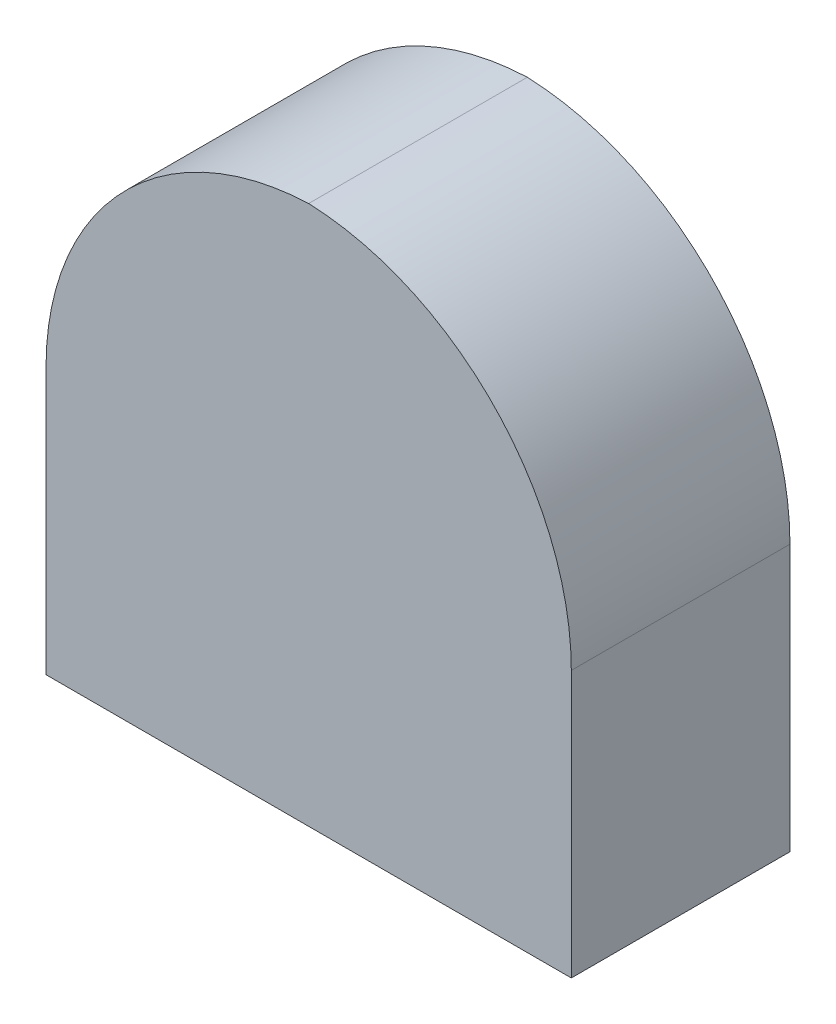
ISO-10303-21;
HEADER;
FILE_DESCRIPTION(('STEP AP214'),'2;1');
FILE_NAME('part.step','',(''),(''),'','','');
FILE_SCHEMA(('AUTOMOTIVE_DESIGN { 1 0 10303 214 1 1 1 1 }'));
ENDSEC;
DATA;
#1=APPLICATION_CONTEXT('core data for automotive mechanical design processes');
#2=APPLICATION_PROTOCOL_DEFINITION('international standard','automotive_design',2000,#1);
#3=PRODUCT_CONTEXT('',#1,'mechanical');
#4=PRODUCT('Part','Part','',(#3));
#5=PRODUCT_RELATED_PRODUCT_CATEGORY('part','',(#4));
#6=PRODUCT_DEFINITION_FORMATION('','',#4);
#7=PRODUCT_DEFINITION_CONTEXT('part definition',#1,'design');
#8=PRODUCT_DEFINITION('design','',#6,#7);
#9=PRODUCT_DEFINITION_SHAPE('','',#8);
#10=(LENGTH_UNIT() NAMED_UNIT(*) SI_UNIT(.MILLI.,.METRE.));
#11=(NAMED_UNIT(*) PLANE_ANGLE_UNIT() SI_UNIT($,.RADIAN.));
#12=(NAMED_UNIT(*) SI_UNIT($,.STERADIAN.) SOLID_ANGLE_UNIT());
#13=UNCERTAINTY_MEASURE_WITH_UNIT(LENGTH_MEASURE(1.E-05),#10,'distance_accuracy_value','');
#14=(GEOMETRIC_REPRESENTATION_CONTEXT(3) GLOBAL_UNCERTAINTY_ASSIGNED_CONTEXT((#13)) GLOBAL_UNIT_ASSIGNED_CONTEXT((#10,
#11,#12)) REPRESENTATION_CONTEXT('',''));
#15=CARTESIAN_POINT('',(0.,0.,0.));
#16=DIRECTION('',(0.,0.,1.));
#17=DIRECTION('',(1.,0.,0.));
#18=AXIS2_PLACEMENT_3D('',#15,#16,#17);
#19=CARTESIAN_POINT('',(-0.610128470641234,-0.739911279196532,9.64411254969543));
#20=DIRECTION('',(0.,0.,-1.));
#21=DIRECTION('',(-1.,0.,0.));
#22=AXIS2_PLACEMENT_3D('',#19,#20,#21);
#23=CYLINDRICAL_SURFACE('',#22,1.2);
#24=CARTESIAN_POINT('',(-0.610128470641234,-0.739911279196532,4.64887428280202));
#25=DIRECTION('',(0.,0.,1.));
#26=DIRECTION('',(1.,0.,0.));
#27=AXIS2_PLACEMENT_3D('',#24,#25,#26);
#28=CIRCLE('',#27,1.2);
#29=CARTESIAN_POINT('',(0.589871529358765,-0.739911279196532,4.64887428280202));
#30=VERTEX_POINT('',#29);
#31=EDGE_CURVE('E155',#30,#30,#28,.T.);
#32=ORIENTED_EDGE('',*,*,#31,.F.);
#33=EDGE_LOOP('',(#32));
#34=FACE_BOUND('',#33,.T.);
#35=CARTESIAN_POINT('',(-0.610128470641234,-0.739911279196532,4.65));
#36=DIRECTION('',(0.,0.,1.));
#37=DIRECTION('',(1.,0.,0.));
#38=AXIS2_PLACEMENT_3D('',#35,#36,#37);
#39=CIRCLE('',#38,1.2);
#40=CARTESIAN_POINT('',(0.589871529358765,-0.739911279196532,4.65));
#41=VERTEX_POINT('',#40);
#42=EDGE_CURVE('E11',#41,#41,#39,.F.);
#43=ORIENTED_EDGE('',*,*,#42,.F.);
#44=EDGE_LOOP('',(#43));
#45=FACE_BOUND('',#44,.T.);
#46=ADVANCED_FACE('F41',(#34,#45),#23,.F.);
#47=CARTESIAN_POINT('',(-4.45973164437162,0.,3.04887428280202));
#48=DIRECTION('',(0.,0.,1.));
#49=DIRECTION('',(1.,0.,0.));
#50=AXIS2_PLACEMENT_3D('',#47,#48,#49);
#51=PLANE('',#50);
#52=CARTESIAN_POINT('',(-0.459731644371615,-0.799999999999998,3.04887428280202));
#53=DIRECTION('',(0.,0.,1.));
#54=DIRECTION('',(1.,0.,0.));
#55=AXIS2_PLACEMENT_3D('',#52,#53,#54);
#56=CIRCLE('',#55,4.);
#57=CARTESIAN_POINT('',(-4.45973164437162,-0.799999999999998,3.04887428280202));
#58=VERTEX_POINT('',#57);
#59=CARTESIAN_POINT('',(-0.614730354205517,3.19699579683915,3.04887428280202));
#60=VERTEX_POINT('',#59);
#61=EDGE_CURVE('E178',#58,#60,#56,.F.);
#62=ORIENTED_EDGE('',*,*,#61,.T.);
#63=CARTESIAN_POINT('',(-0.769729064039416,-0.799999999999998,3.04887428280202));
#64=DIRECTION('',(0.,0.,1.));
#65=DIRECTION('',(1.,0.,0.));
#66=AXIS2_PLACEMENT_3D('',#63,#64,#65);
#67=CIRCLE('',#66,4.);
#68=CARTESIAN_POINT('',(3.23027093596058,-0.799999999999998,3.04887428280202));
#69=VERTEX_POINT('',#68);
#70=EDGE_CURVE('E182',#60,#69,#67,.F.);
#71=ORIENTED_EDGE('',*,*,#70,.T.);
#72=DIRECTION('',(0.,-1.,0.));
#73=VECTOR('',#72,1.);
#74=CARTESIAN_POINT('',(3.23027093596058,0.,3.04887428280202));
#75=LINE('',#74,#73);
#76=CARTESIAN_POINT('',(3.23027093596058,-4.7,3.04887428280202));
#77=VERTEX_POINT('',#76);
#78=EDGE_CURVE('E170',#69,#77,#75,.T.);
#79=ORIENTED_EDGE('',*,*,#78,.T.);
#80=DIRECTION('',(1.,0.,0.));
#81=VECTOR('',#80,1.);
#82=CARTESIAN_POINT('',(3.23027093596058,-4.7,3.04887428280202));
#83=LINE('',#82,#81);
#84=CARTESIAN_POINT('',(-4.45973164437162,-4.7,3.04887428280202));
#85=VERTEX_POINT('',#84);
#86=EDGE_CURVE('E164',#85,#77,#83,.T.);
#87=ORIENTED_EDGE('',*,*,#86,.F.);
#88=DIRECTION('',(0.,-1.,0.));
#89=VECTOR('',#88,1.);
#90=CARTESIAN_POINT('',(-4.45973164437162,0.,3.04887428280202));
#91=LINE('',#90,#89);
#92=EDGE_CURVE('E171',#58,#85,#91,.T.);
#93=ORIENTED_EDGE('',*,*,#92,.F.);
#94=EDGE_LOOP('',(#62,#71,#79,#87,#93));
#95=FACE_BOUND('',#94,.T.);
#96=CARTESIAN_POINT('',(-0.085534200490626,-0.226118598449567,3.04887428280202));
#97=DIRECTION('',(0.,0.,1.));
#98=DIRECTION('',(1.,0.,0.));
#99=AXIS2_PLACEMENT_3D('',#96,#97,#98);
#100=CIRCLE('',#99,2.26809198222787);
#101=CARTESIAN_POINT('',(2.04645375986085,0.547747395610594,3.04887428280202));
#102=VERTEX_POINT('',#101);
#103=CARTESIAN_POINT('',(1.22341819618665,1.62614619446725,3.04887428280202));
#104=VERTEX_POINT('',#103);
#105=EDGE_CURVE('E142',#102,#104,#100,.T.);
#106=ORIENTED_EDGE('',*,*,#105,.T.);
#107=CARTESIAN_POINT('',(-0.611285784576483,-0.442577941691503,3.04887428280202));
#108=DIRECTION('',(0.,0.,-1.));
#109=DIRECTION('',(1.,0.,0.));
#110=AXIS2_PLACEMENT_3D('',#107,#108,#109);
#111=CIRCLE('',#110,2.76509642662853);
#112=CARTESIAN_POINT('',(-2.41977565508386,1.64910144024686,3.04887428280202));
#113=VERTEX_POINT('',#112);
#114=EDGE_CURVE('E431',#113,#104,#111,.T.);
#115=ORIENTED_EDGE('',*,*,#114,.F.);
#116=CARTESIAN_POINT('',(-1.1439265079204,-0.226118598449567,3.04887428280202));
#117=DIRECTION('',(0.,0.,1.));
#118=DIRECTION('',(-1.,0.,0.));
#119=AXIS2_PLACEMENT_3D('',#116,#117,#118);
#120=CIRCLE('',#119,2.26809198222787);
#121=CARTESIAN_POINT('',(-3.27994862973724,0.542160929364693,3.04887428280202));
#122=VERTEX_POINT('',#121);
#123=EDGE_CURVE('E451',#113,#122,#120,.T.);
#124=ORIENTED_EDGE('',*,*,#123,.T.);
#125=DIRECTION('',(0.00335891271015021,-0.999994358836791,0.));
#126=VECTOR('',#125,1.);
#127=CARTESIAN_POINT('',(-3.2850756228245,1.98935488283943,3.04887428280202));
#128=LINE('',#127,#126);
#129=CARTESIAN_POINT('',(-3.26671070114332,-3.4781340537327,3.04887428280202));
#130=VERTEX_POINT('',#129);
#131=EDGE_CURVE('E137',#130,#122,#128,.F.);
#132=ORIENTED_EDGE('',*,*,#131,.F.);
#133=DIRECTION('',(-0.999992789074859,0.003797604282157,0.));
#134=VECTOR('',#133,1.);
#135=CARTESIAN_POINT('',(-3.26671070114332,-3.4781340537327,3.04887428280202));
#136=LINE('',#135,#134);
#137=CARTESIAN_POINT('',(2.04645375986085,-3.49831149533963,3.04887428280202));
#138=VERTEX_POINT('',#137);
#139=EDGE_CURVE('E154',#138,#130,#136,.T.);
#140=ORIENTED_EDGE('',*,*,#139,.F.);
#141=DIRECTION('',(0.,-1.,0.));
#142=VECTOR('',#141,1.);
#143=CARTESIAN_POINT('',(2.04645375986085,-3.49831149533963,3.04887428280202));
#144=LINE('',#143,#142);
#145=EDGE_CURVE('E152',#102,#138,#144,.T.);
#146=ORIENTED_EDGE('',*,*,#145,.F.);
#147=EDGE_LOOP('',(#106,#115,#124,#132,#140,#146));
#148=FACE_BOUND('',#147,.T.);
#149=ADVANCED_FACE('F217',(#95,#148),#51,.F.);
#150=CARTESIAN_POINT('',(-3.2850756228245,1.98935488283943,4.64887428280202));
#151=DIRECTION('',(-0.999994358836791,-0.00335891271015021,0.));
#152=DIRECTION('',(0.00335891271015021,-0.999994358836791,0.));
#153=AXIS2_PLACEMENT_3D('',#150,#151,#152);
#154=PLANE('',#153);
#155=DIRECTION('',(0.,0.,-1.));
#156=VECTOR('',#155,1.);
#157=CARTESIAN_POINT('',(-3.27591446827188,0.547747395610593,4.64887428280202));
#158=LINE('',#157,#156);
#159=CARTESIAN_POINT('',(-3.2799486297362,0.542160929378175,4.64887428280202));
#160=VERTEX_POINT('',#159);
#161=EDGE_CURVE('E129',#160,#122,#158,.T.);
#162=ORIENTED_EDGE('',*,*,#161,.F.);
#163=DIRECTION('',(-0.00335891271015021,0.999994358836791,0.));
#164=VECTOR('',#163,1.);
#165=CARTESIAN_POINT('',(-3.26671070114332,-3.4781340537327,4.64887428280202));
#166=LINE('',#165,#164);
#167=CARTESIAN_POINT('',(-3.26671070114332,-3.4781340537327,4.64887428280202));
#168=VERTEX_POINT('',#167);
#169=EDGE_CURVE('E157',#168,#160,#166,.T.);
#170=ORIENTED_EDGE('',*,*,#169,.F.);
#171=DIRECTION('',(0.,0.,-1.));
#172=VECTOR('',#171,1.);
#173=CARTESIAN_POINT('',(-3.26671070114332,-3.4781340537327,4.64887428280202));
#174=LINE('',#173,#172);
#175=EDGE_CURVE('E72',#168,#130,#174,.T.);
#176=ORIENTED_EDGE('',*,*,#175,.T.);
#177=ORIENTED_EDGE('',*,*,#131,.T.);
#178=EDGE_LOOP('',(#162,#170,#176,#177));
#179=FACE_BOUND('',#178,.T.);
#180=ADVANCED_FACE('F207',(#179),#154,.F.);
#181=CARTESIAN_POINT('',(0.,0.,4.64887428280202));
#182=DIRECTION('',(0.,0.,1.));
#183=DIRECTION('',(1.,0.,0.));
#184=AXIS2_PLACEMENT_3D('',#181,#182,#183);
#185=PLANE('',#184);
#186=CARTESIAN_POINT('',(-0.611285784576483,-0.442577941691503,4.64887428280202));
#187=DIRECTION('',(0.,0.,-1.));
#188=DIRECTION('',(1.,0.,0.));
#189=AXIS2_PLACEMENT_3D('',#186,#187,#188);
#190=CIRCLE('',#189,2.76509642662853);
#191=CARTESIAN_POINT('',(-2.41977565508386,1.64910144024686,4.64887428280202));
#192=VERTEX_POINT('',#191);
#193=CARTESIAN_POINT('',(1.22341819618665,1.62614619446725,4.64887428280202));
#194=VERTEX_POINT('',#193);
#195=EDGE_CURVE('E124',#192,#194,#190,.T.);
#196=ORIENTED_EDGE('',*,*,#195,.T.);
#197=CARTESIAN_POINT('',(-0.085534200490626,-0.226118598449567,4.64887428280202));
#198=DIRECTION('',(0.,0.,1.));
#199=DIRECTION('',(1.,0.,0.));
#200=AXIS2_PLACEMENT_3D('',#197,#198,#199);
#201=CIRCLE('',#200,2.26809198222787);
#202=CARTESIAN_POINT('',(2.04645375986085,0.547747395610594,4.64887428280202));
#203=VERTEX_POINT('',#202);
#204=EDGE_CURVE('E119',#203,#194,#201,.T.);
#205=ORIENTED_EDGE('',*,*,#204,.F.);
#206=DIRECTION('',(0.,-1.,0.));
#207=VECTOR('',#206,1.);
#208=CARTESIAN_POINT('',(2.04645375986085,-3.49831149533963,4.64887428280202));
#209=LINE('',#208,#207);
#210=CARTESIAN_POINT('',(2.04645375986085,-3.49831149533963,4.64887428280202));
#211=VERTEX_POINT('',#210);
#212=EDGE_CURVE('E83',#203,#211,#209,.T.);
#213=ORIENTED_EDGE('',*,*,#212,.T.);
#214=DIRECTION('',(-0.999992789074859,0.003797604282157,0.));
#215=VECTOR('',#214,1.);
#216=CARTESIAN_POINT('',(-3.26671070114332,-3.4781340537327,4.64887428280202));
#217=LINE('',#216,#215);
#218=EDGE_CURVE('E136',#211,#168,#217,.T.);
#219=ORIENTED_EDGE('',*,*,#218,.T.);
#220=ORIENTED_EDGE('',*,*,#169,.T.);
#221=CARTESIAN_POINT('',(-1.1439265079204,-0.226118598449567,4.64887428280202));
#222=DIRECTION('',(0.,0.,1.));
#223=DIRECTION('',(-1.,0.,0.));
#224=AXIS2_PLACEMENT_3D('',#221,#222,#223);
#225=CIRCLE('',#224,2.26809198222787);
#226=EDGE_CURVE('E58',#192,#160,#225,.T.);
#227=ORIENTED_EDGE('',*,*,#226,.F.);
#228=EDGE_LOOP('',(#196,#205,#213,#219,#220,#227));
#229=FACE_BOUND('',#228,.T.);
#230=ORIENTED_EDGE('',*,*,#31,.T.);
#231=EDGE_LOOP('',(#230));
#232=FACE_BOUND('',#231,.T.);
#233=ADVANCED_FACE('F120',(#229,#232),#185,.F.);
#234=CARTESIAN_POINT('',(-0.584729064039415,6.10800520066022,6.25));
#235=DIRECTION('',(0.,0.,1.));
#236=DIRECTION('',(1.,0.,0.));
#237=AXIS2_PLACEMENT_3D('',#234,#235,#236);
#238=PLANE('',#237);
#239=DIRECTION('',(0.,-1.,0.));
#240=VECTOR('',#239,1.);
#241=CARTESIAN_POINT('',(3.23027093596058,3.2,6.25));
#242=LINE('',#241,#240);
#243=CARTESIAN_POINT('',(3.23027093596058,-0.799999999999998,6.25));
#244=VERTEX_POINT('',#243);
#245=CARTESIAN_POINT('',(3.23027093596058,-4.7,6.25));
#246=VERTEX_POINT('',#245);
#247=EDGE_CURVE('E176',#244,#246,#242,.T.);
#248=ORIENTED_EDGE('',*,*,#247,.F.);
#249=CARTESIAN_POINT('',(-0.769729064039416,-0.799999999999998,6.25));
#250=DIRECTION('',(0.,0.,1.));
#251=DIRECTION('',(1.,0.,0.));
#252=AXIS2_PLACEMENT_3D('',#249,#250,#251);
#253=CIRCLE('',#252,4.);
#254=CARTESIAN_POINT('',(-0.614730354205517,3.19699579683915,6.25));
#255=VERTEX_POINT('',#254);
#256=EDGE_CURVE('E189',#244,#255,#253,.T.);
#257=ORIENTED_EDGE('',*,*,#256,.T.);
#258=CARTESIAN_POINT('',(-0.459731644371615,-0.799999999999998,6.25));
#259=DIRECTION('',(0.,0.,1.));
#260=DIRECTION('',(1.,0.,0.));
#261=AXIS2_PLACEMENT_3D('',#258,#259,#260);
#262=CIRCLE('',#261,4.);
#263=CARTESIAN_POINT('',(-4.45973164437162,-0.799999999999999,6.25));
#264=VERTEX_POINT('',#263);
#265=EDGE_CURVE('E187',#255,#264,#262,.T.);
#266=ORIENTED_EDGE('',*,*,#265,.T.);
#267=DIRECTION('',(0.,-1.,0.));
#268=VECTOR('',#267,1.);
#269=CARTESIAN_POINT('',(-4.45973164437162,7.2874065635489,6.25));
#270=LINE('',#269,#268);
#271=CARTESIAN_POINT('',(-4.45973164437162,-4.7,6.25));
#272=VERTEX_POINT('',#271);
#273=EDGE_CURVE('E173',#264,#272,#270,.T.);
#274=ORIENTED_EDGE('',*,*,#273,.T.);
#275=DIRECTION('',(-1.,0.,0.));
#276=VECTOR('',#275,1.);
#277=CARTESIAN_POINT('',(-4.45973164437162,-4.7,6.25));
#278=LINE('',#277,#276);
#279=EDGE_CURVE('E158',#246,#272,#278,.T.);
#280=ORIENTED_EDGE('',*,*,#279,.F.);
#281=EDGE_LOOP('',(#248,#257,#266,#274,#280));
#282=FACE_BOUND('',#281,.T.);
#283=ADVANCED_FACE('F238',(#282),#238,.T.);
#284=CARTESIAN_POINT('',(-4.45973164437162,3.2,0.));
#285=DIRECTION('',(1.,0.,0.));
#286=DIRECTION('',(0.,0.,-1.));
#287=AXIS2_PLACEMENT_3D('',#284,#285,#286);
#288=PLANE('',#287);
#289=ORIENTED_EDGE('',*,*,#273,.F.);
#290=DIRECTION('',(0.,0.,1.));
#291=VECTOR('',#290,1.);
#292=CARTESIAN_POINT('',(-4.45973164437162,-0.799999999999999,0.));
#293=LINE('',#292,#291);
#294=EDGE_CURVE('E50',#264,#58,#293,.F.);
#295=ORIENTED_EDGE('',*,*,#294,.T.);
#296=ORIENTED_EDGE('',*,*,#92,.T.);
#297=DIRECTION('',(0.,0.,-1.));
#298=VECTOR('',#297,1.);
#299=CARTESIAN_POINT('',(-4.45973164437162,-4.7,3.04887428280202));
#300=LINE('',#299,#298);
#301=EDGE_CURVE('E161',#272,#85,#300,.T.);
#302=ORIENTED_EDGE('',*,*,#301,.F.);
#303=EDGE_LOOP('',(#289,#295,#296,#302));
#304=FACE_BOUND('',#303,.T.);
#305=ADVANCED_FACE('F234',(#304),#288,.F.);
#306=CARTESIAN_POINT('',(3.23027093596058,3.2,7.9));
#307=DIRECTION('',(-1.,0.,0.));
#308=DIRECTION('',(0.,-1.,0.));
#309=AXIS2_PLACEMENT_3D('',#306,#307,#308);
#310=PLANE('',#309);
#311=ORIENTED_EDGE('',*,*,#78,.F.);
#312=DIRECTION('',(0.,0.,-1.));
#313=VECTOR('',#312,1.);
#314=CARTESIAN_POINT('',(3.23027093596058,-0.799999999999998,7.9));
#315=LINE('',#314,#313);
#316=EDGE_CURVE('E184',#69,#244,#315,.F.);
#317=ORIENTED_EDGE('',*,*,#316,.T.);
#318=ORIENTED_EDGE('',*,*,#247,.T.);
#319=DIRECTION('',(0.,0.,1.));
#320=VECTOR('',#319,1.);
#321=CARTESIAN_POINT('',(3.23027093596058,-4.7,6.25));
#322=LINE('',#321,#320);
#323=EDGE_CURVE('E167',#77,#246,#322,.T.);
#324=ORIENTED_EDGE('',*,*,#323,.F.);
#325=EDGE_LOOP('',(#311,#317,#318,#324));
#326=FACE_BOUND('',#325,.T.);
#327=ADVANCED_FACE('F227',(#326),#310,.F.);
#328=CARTESIAN_POINT('',(0.,-4.7,0.));
#329=DIRECTION('',(0.,1.,0.));
#330=DIRECTION('',(0.,0.,1.));
#331=AXIS2_PLACEMENT_3D('',#328,#329,#330);
#332=PLANE('',#331);
#333=ORIENTED_EDGE('',*,*,#279,.T.);
#334=ORIENTED_EDGE('',*,*,#301,.T.);
#335=ORIENTED_EDGE('',*,*,#86,.T.);
#336=ORIENTED_EDGE('',*,*,#323,.T.);
#337=EDGE_LOOP('',(#333,#334,#335,#336));
#338=FACE_BOUND('',#337,.T.);
#339=ADVANCED_FACE('F224',(#338),#332,.F.);
#340=CARTESIAN_POINT('',(2.04645375986085,-3.49831149533963,4.64887428280202));
#341=DIRECTION('',(1.,0.,0.));
#342=DIRECTION('',(0.,0.,-1.));
#343=AXIS2_PLACEMENT_3D('',#340,#341,#342);
#344=PLANE('',#343);
#345=ORIENTED_EDGE('',*,*,#212,.F.);
#346=DIRECTION('',(0.,0.,-1.));
#347=VECTOR('',#346,1.);
#348=CARTESIAN_POINT('',(2.04645375986085,0.547747395610593,4.64887428280202));
#349=LINE('',#348,#347);
#350=EDGE_CURVE('E128',#203,#102,#349,.T.);
#351=ORIENTED_EDGE('',*,*,#350,.T.);
#352=ORIENTED_EDGE('',*,*,#145,.T.);
#353=DIRECTION('',(0.,0.,-1.));
#354=VECTOR('',#353,1.);
#355=CARTESIAN_POINT('',(2.04645375986085,-3.49831149533963,4.64887428280202));
#356=LINE('',#355,#354);
#357=EDGE_CURVE('E135',#211,#138,#356,.T.);
#358=ORIENTED_EDGE('',*,*,#357,.F.);
#359=EDGE_LOOP('',(#345,#351,#352,#358));
#360=FACE_BOUND('',#359,.T.);
#361=ADVANCED_FACE('F132',(#360),#344,.F.);
#362=CARTESIAN_POINT('',(-3.26671070114332,-3.4781340537327,4.64887428280202));
#363=DIRECTION('',(-0.003797604282157,-0.999992789074859,0.));
#364=DIRECTION('',(0.999992789074859,-0.003797604282157,0.));
#365=AXIS2_PLACEMENT_3D('',#362,#363,#364);
#366=PLANE('',#365);
#367=ORIENTED_EDGE('',*,*,#139,.T.);
#368=ORIENTED_EDGE('',*,*,#175,.F.);
#369=ORIENTED_EDGE('',*,*,#218,.F.);
#370=ORIENTED_EDGE('',*,*,#357,.T.);
#371=EDGE_LOOP('',(#367,#368,#369,#370));
#372=FACE_BOUND('',#371,.T.);
#373=ADVANCED_FACE('F219',(#372),#366,.F.);
#374=CARTESIAN_POINT('',(-0.459731644371615,-0.799999999999998,7.9));
#375=DIRECTION('',(0.,0.,1.));
#376=DIRECTION('',(1.,0.,0.));
#377=AXIS2_PLACEMENT_3D('',#374,#375,#376);
#378=CYLINDRICAL_SURFACE('',#377,4.);
#379=ORIENTED_EDGE('',*,*,#294,.F.);
#380=ORIENTED_EDGE('',*,*,#265,.F.);
#381=DIRECTION('',(0.,0.,1.));
#382=VECTOR('',#381,1.);
#383=CARTESIAN_POINT('',(-0.614730354205517,3.19699579683915,4.64943714140101));
#384=LINE('',#383,#382);
#385=EDGE_CURVE('E144',#60,#255,#384,.T.);
#386=ORIENTED_EDGE('',*,*,#385,.F.);
#387=ORIENTED_EDGE('',*,*,#61,.F.);
#388=EDGE_LOOP('',(#379,#380,#386,#387));
#389=FACE_BOUND('',#388,.T.);
#390=ADVANCED_FACE('F43',(#389),#378,.T.);
#391=CARTESIAN_POINT('',(-0.769729064039416,-0.799999999999998,7.9));
#392=DIRECTION('',(0.,0.,-1.));
#393=DIRECTION('',(-1.,0.,0.));
#394=AXIS2_PLACEMENT_3D('',#391,#392,#393);
#395=CYLINDRICAL_SURFACE('',#394,4.);
#396=ORIENTED_EDGE('',*,*,#256,.F.);
#397=ORIENTED_EDGE('',*,*,#316,.F.);
#398=ORIENTED_EDGE('',*,*,#70,.F.);
#399=ORIENTED_EDGE('',*,*,#385,.T.);
#400=EDGE_LOOP('',(#396,#397,#398,#399));
#401=FACE_BOUND('',#400,.T.);
#402=ADVANCED_FACE('F242',(#401),#395,.T.);
#403=CARTESIAN_POINT('',(-0.085534200490626,-0.226118598449567,4.64887428280202));
#404=DIRECTION('',(0.,0.,-1.));
#405=DIRECTION('',(-1.,0.,0.));
#406=AXIS2_PLACEMENT_3D('',#403,#404,#405);
#407=CYLINDRICAL_SURFACE('',#406,2.26809198222787);
#408=DIRECTION('',(0.,0.,-1.));
#409=VECTOR('',#408,1.);
#410=CARTESIAN_POINT('',(1.22341819618665,1.62614619446725,4.64887428280202));
#411=LINE('',#410,#409);
#412=EDGE_CURVE('E432',#194,#104,#411,.T.);
#413=ORIENTED_EDGE('',*,*,#412,.T.);
#414=ORIENTED_EDGE('',*,*,#105,.F.);
#415=ORIENTED_EDGE('',*,*,#350,.F.);
#416=ORIENTED_EDGE('',*,*,#204,.T.);
#417=EDGE_LOOP('',(#413,#414,#415,#416));
#418=FACE_BOUND('',#417,.T.);
#419=ADVANCED_FACE('F140',(#418),#407,.F.);
#420=CARTESIAN_POINT('',(-1.1439265079204,-0.226118598449567,4.64887428280202));
#421=DIRECTION('',(0.,0.,-1.));
#422=DIRECTION('',(-1.,0.,0.));
#423=AXIS2_PLACEMENT_3D('',#420,#421,#422);
#424=CYLINDRICAL_SURFACE('',#423,2.26809198222787);
#425=DIRECTION('',(0.,0.,-1.));
#426=VECTOR('',#425,1.);
#427=CARTESIAN_POINT('',(-2.41977565508386,1.64910144024686,4.64887428280202));
#428=LINE('',#427,#426);
#429=EDGE_CURVE('E434',#192,#113,#428,.T.);
#430=ORIENTED_EDGE('',*,*,#429,.F.);
#431=ORIENTED_EDGE('',*,*,#226,.T.);
#432=ORIENTED_EDGE('',*,*,#161,.T.);
#433=ORIENTED_EDGE('',*,*,#123,.F.);
#434=EDGE_LOOP('',(#430,#431,#432,#433));
#435=FACE_BOUND('',#434,.T.);
#436=ADVANCED_FACE('F249',(#435),#424,.F.);
#437=CARTESIAN_POINT('',(-0.611285784576483,-0.442577941691503,4.64887428280202));
#438=DIRECTION('',(0.,0.,-1.));
#439=DIRECTION('',(-1.,0.,0.));
#440=AXIS2_PLACEMENT_3D('',#437,#438,#439);
#441=CYLINDRICAL_SURFACE('',#440,2.76509642662853);
#442=ORIENTED_EDGE('',*,*,#114,.T.);
#443=ORIENTED_EDGE('',*,*,#412,.F.);
#444=ORIENTED_EDGE('',*,*,#195,.F.);
#445=ORIENTED_EDGE('',*,*,#429,.T.);
#446=EDGE_LOOP('',(#442,#443,#444,#445));
#447=FACE_BOUND('',#446,.T.);
#448=ADVANCED_FACE('F263',(#447),#441,.F.);
#449=CARTESIAN_POINT('',(-0.610128470641234,-0.739911279196532,4.65));
#450=DIRECTION('',(0.,0.,1.));
#451=DIRECTION('',(1.,0.,0.));
#452=AXIS2_PLACEMENT_3D('',#449,#450,#451);
#453=PLANE('',#452);
#454=ORIENTED_EDGE('',*,*,#42,.T.);
#455=EDGE_LOOP('',(#454));
#456=FACE_BOUND('',#455,.T.);
#457=ADVANCED_FACE('F265',(#456),#453,.F.);
#458=CLOSED_SHELL('',(#46,#149,#180,#233,#283,#305,#327,#339,#361,#373,#390,#402,#419,#436,#448,#457));
#459=MANIFOLD_SOLID_BREP('B2',#458);
#460=ADVANCED_BREP_SHAPE_REPRESENTATION('',(#18,#459),#14);
#461=SHAPE_DEFINITION_REPRESENTATION(#9,#460);
ENDSEC;
END-ISO-10303-21;
